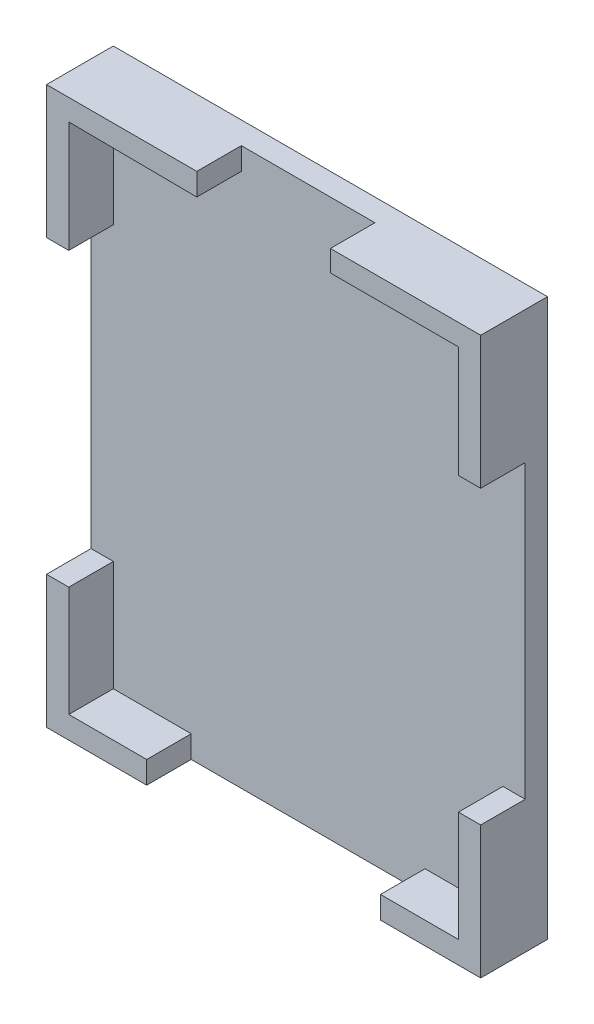
ISO-10303-21;
HEADER;
FILE_DESCRIPTION(('STEP AP214'),'2;1');
FILE_NAME('part.step','',(''),(''),'','','');
FILE_SCHEMA(('AUTOMOTIVE_DESIGN { 1 0 10303 214 1 1 1 1 }'));
ENDSEC;
DATA;
#1=APPLICATION_CONTEXT('core data for automotive mechanical design processes');
#2=APPLICATION_PROTOCOL_DEFINITION('international standard','automotive_design',2000,#1);
#3=PRODUCT_CONTEXT('',#1,'mechanical');
#4=PRODUCT('Part','Part','',(#3));
#5=PRODUCT_RELATED_PRODUCT_CATEGORY('part','',(#4));
#6=PRODUCT_DEFINITION_FORMATION('','',#4);
#7=PRODUCT_DEFINITION_CONTEXT('part definition',#1,'design');
#8=PRODUCT_DEFINITION('design','',#6,#7);
#9=PRODUCT_DEFINITION_SHAPE('','',#8);
#10=(LENGTH_UNIT() NAMED_UNIT(*) SI_UNIT(.MILLI.,.METRE.));
#11=(NAMED_UNIT(*) PLANE_ANGLE_UNIT() SI_UNIT($,.RADIAN.));
#12=(NAMED_UNIT(*) SI_UNIT($,.STERADIAN.) SOLID_ANGLE_UNIT());
#13=UNCERTAINTY_MEASURE_WITH_UNIT(LENGTH_MEASURE(1.E-05),#10,'distance_accuracy_value','');
#14=(GEOMETRIC_REPRESENTATION_CONTEXT(3) GLOBAL_UNCERTAINTY_ASSIGNED_CONTEXT((#13)) GLOBAL_UNIT_ASSIGNED_CONTEXT((#10,
#11,#12)) REPRESENTATION_CONTEXT('',''));
#15=CARTESIAN_POINT('',(0.,0.,0.));
#16=DIRECTION('',(0.,0.,1.));
#17=DIRECTION('',(1.,0.,0.));
#18=AXIS2_PLACEMENT_3D('',#15,#16,#17);
#19=CARTESIAN_POINT('',(0.,0.,2.));
#20=DIRECTION('',(0.,0.,1.));
#21=DIRECTION('',(1.,0.,0.));
#22=AXIS2_PLACEMENT_3D('',#19,#20,#21);
#23=PLANE('',#22);
#24=DIRECTION('',(-1.,0.,0.));
#25=VECTOR('',#24,1.);
#26=CARTESIAN_POINT('',(0.,2.,2.));
#27=LINE('',#26,#25);
#28=CARTESIAN_POINT('',(9.,2.,2.));
#29=VERTEX_POINT('',#28);
#30=CARTESIAN_POINT('',(2.,2.,2.));
#31=VERTEX_POINT('',#30);
#32=EDGE_CURVE('E54',#29,#31,#27,.T.);
#33=ORIENTED_EDGE('',*,*,#32,.F.);
#34=DIRECTION('',(0.,-1.,0.));
#35=VECTOR('',#34,1.);
#36=CARTESIAN_POINT('',(9.,0.,2.));
#37=LINE('',#36,#35);
#38=CARTESIAN_POINT('',(9.,0.,2.));
#39=VERTEX_POINT('',#38);
#40=EDGE_CURVE('E245',#29,#39,#37,.T.);
#41=ORIENTED_EDGE('',*,*,#40,.T.);
#42=DIRECTION('',(1.,0.,0.));
#43=VECTOR('',#42,1.);
#44=CARTESIAN_POINT('',(0.,0.,2.));
#45=LINE('',#44,#43);
#46=CARTESIAN_POINT('',(30.,0.,2.));
#47=VERTEX_POINT('',#46);
#48=EDGE_CURVE('E375',#39,#47,#45,.T.);
#49=ORIENTED_EDGE('',*,*,#48,.T.);
#50=DIRECTION('',(0.,-1.,0.));
#51=VECTOR('',#50,1.);
#52=CARTESIAN_POINT('',(30.,0.,2.));
#53=LINE('',#52,#51);
#54=CARTESIAN_POINT('',(30.,2.,2.));
#55=VERTEX_POINT('',#54);
#56=EDGE_CURVE('E284',#55,#47,#53,.T.);
#57=ORIENTED_EDGE('',*,*,#56,.F.);
#58=DIRECTION('',(1.,0.,0.));
#59=VECTOR('',#58,1.);
#60=CARTESIAN_POINT('',(0.,2.,2.));
#61=LINE('',#60,#59);
#62=CARTESIAN_POINT('',(37.,2.,2.));
#63=VERTEX_POINT('',#62);
#64=EDGE_CURVE('E275',#55,#63,#61,.T.);
#65=ORIENTED_EDGE('',*,*,#64,.T.);
#66=DIRECTION('',(0.,-1.,0.));
#67=VECTOR('',#66,1.);
#68=CARTESIAN_POINT('',(37.,0.,2.));
#69=LINE('',#68,#67);
#70=CARTESIAN_POINT('',(37.,11.9052817792916,2.));
#71=VERTEX_POINT('',#70);
#72=EDGE_CURVE('E278',#71,#63,#69,.T.);
#73=ORIENTED_EDGE('',*,*,#72,.F.);
#74=DIRECTION('',(1.,0.,0.));
#75=VECTOR('',#74,1.);
#76=CARTESIAN_POINT('',(0.,11.9052817792916,2.));
#77=LINE('',#76,#75);
#78=CARTESIAN_POINT('',(39.,11.9052817792916,2.));
#79=VERTEX_POINT('',#78);
#80=EDGE_CURVE('E281',#71,#79,#77,.T.);
#81=ORIENTED_EDGE('',*,*,#80,.T.);
#82=DIRECTION('',(0.,1.,0.));
#83=VECTOR('',#82,1.);
#84=CARTESIAN_POINT('',(39.,0.,2.));
#85=LINE('',#84,#83);
#86=CARTESIAN_POINT('',(39.,38.0947182207085,2.));
#87=VERTEX_POINT('',#86);
#88=EDGE_CURVE('E378',#79,#87,#85,.T.);
#89=ORIENTED_EDGE('',*,*,#88,.T.);
#90=DIRECTION('',(1.,0.,0.));
#91=VECTOR('',#90,1.);
#92=CARTESIAN_POINT('',(0.,38.0947182207085,2.));
#93=LINE('',#92,#91);
#94=CARTESIAN_POINT('',(37.,38.0947182207085,2.));
#95=VERTEX_POINT('',#94);
#96=EDGE_CURVE('E319',#95,#87,#93,.T.);
#97=ORIENTED_EDGE('',*,*,#96,.F.);
#98=DIRECTION('',(0.,1.,0.));
#99=VECTOR('',#98,1.);
#100=CARTESIAN_POINT('',(37.,0.,2.));
#101=LINE('',#100,#99);
#102=CARTESIAN_POINT('',(37.,48.0947182207085,2.));
#103=VERTEX_POINT('',#102);
#104=EDGE_CURVE('E322',#95,#103,#101,.T.);
#105=ORIENTED_EDGE('',*,*,#104,.T.);
#106=DIRECTION('',(1.,0.,0.));
#107=VECTOR('',#106,1.);
#108=CARTESIAN_POINT('',(0.,48.0947182207085,2.));
#109=LINE('',#108,#107);
#110=CARTESIAN_POINT('',(25.5,48.0947182207085,2.));
#111=VERTEX_POINT('',#110);
#112=EDGE_CURVE('E324',#111,#103,#109,.T.);
#113=ORIENTED_EDGE('',*,*,#112,.F.);
#114=DIRECTION('',(0.,-1.,0.));
#115=VECTOR('',#114,1.);
#116=CARTESIAN_POINT('',(25.5,0.,2.));
#117=LINE('',#116,#115);
#118=CARTESIAN_POINT('',(25.5,50.,2.));
#119=VERTEX_POINT('',#118);
#120=EDGE_CURVE('E327',#119,#111,#117,.T.);
#121=ORIENTED_EDGE('',*,*,#120,.F.);
#122=DIRECTION('',(1.,0.,0.));
#123=VECTOR('',#122,1.);
#124=CARTESIAN_POINT('',(0.,50.,2.));
#125=LINE('',#124,#123);
#126=CARTESIAN_POINT('',(13.5,50.,2.));
#127=VERTEX_POINT('',#126);
#128=EDGE_CURVE('E380',#127,#119,#125,.T.);
#129=ORIENTED_EDGE('',*,*,#128,.F.);
#130=DIRECTION('',(0.,1.,0.));
#131=VECTOR('',#130,1.);
#132=CARTESIAN_POINT('',(13.5,0.,2.));
#133=LINE('',#132,#131);
#134=CARTESIAN_POINT('',(13.5,48.,2.));
#135=VERTEX_POINT('',#134);
#136=EDGE_CURVE('E365',#135,#127,#133,.T.);
#137=ORIENTED_EDGE('',*,*,#136,.F.);
#138=DIRECTION('',(-0.999966082854809,0.00823608766407027,0.));
#139=VECTOR('',#138,1.);
#140=CARTESIAN_POINT('',(0.396234546725618,48.1079274215926,2.));
#141=LINE('',#140,#139);
#142=CARTESIAN_POINT('',(2.00000000000001,48.0947182207085,2.));
#143=VERTEX_POINT('',#142);
#144=EDGE_CURVE('E368',#135,#143,#141,.T.);
#145=ORIENTED_EDGE('',*,*,#144,.T.);
#146=DIRECTION('',(0.,1.,0.));
#147=VECTOR('',#146,1.);
#148=CARTESIAN_POINT('',(2.00000000000001,0.,2.));
#149=LINE('',#148,#147);
#150=CARTESIAN_POINT('',(2.00000000000001,38.0947182207085,2.));
#151=VERTEX_POINT('',#150);
#152=EDGE_CURVE('E370',#151,#143,#149,.T.);
#153=ORIENTED_EDGE('',*,*,#152,.F.);
#154=DIRECTION('',(1.,0.,0.));
#155=VECTOR('',#154,1.);
#156=CARTESIAN_POINT('',(0.,38.0947182207085,2.));
#157=LINE('',#156,#155);
#158=CARTESIAN_POINT('',(0.,38.0947182207085,2.));
#159=VERTEX_POINT('',#158);
#160=EDGE_CURVE('E362',#159,#151,#157,.T.);
#161=ORIENTED_EDGE('',*,*,#160,.F.);
#162=DIRECTION('',(0.,1.,0.));
#163=VECTOR('',#162,1.);
#164=CARTESIAN_POINT('',(0.,0.,2.));
#165=LINE('',#164,#163);
#166=CARTESIAN_POINT('',(0.,11.9052817792916,2.));
#167=VERTEX_POINT('',#166);
#168=EDGE_CURVE('E373',#167,#159,#165,.T.);
#169=ORIENTED_EDGE('',*,*,#168,.F.);
#170=DIRECTION('',(-1.,0.,0.));
#171=VECTOR('',#170,1.);
#172=CARTESIAN_POINT('',(0.,11.9052817792916,2.));
#173=LINE('',#172,#171);
#174=CARTESIAN_POINT('',(2.,11.9052817792916,2.));
#175=VERTEX_POINT('',#174);
#176=EDGE_CURVE('E240',#175,#167,#173,.T.);
#177=ORIENTED_EDGE('',*,*,#176,.F.);
#178=DIRECTION('',(0.,-1.,0.));
#179=VECTOR('',#178,1.);
#180=CARTESIAN_POINT('',(2.,0.,2.));
#181=LINE('',#180,#179);
#182=EDGE_CURVE('E59',#175,#31,#181,.T.);
#183=ORIENTED_EDGE('',*,*,#182,.T.);
#184=EDGE_LOOP('',(#33,#41,#49,#57,#65,#73,#81,#89,#97,#105,#113,#121,#129,#137,#145,#153,#161,
#169,#177,#183));
#185=FACE_BOUND('',#184,.T.);
#186=ADVANCED_FACE('F39',(#185),#23,.T.);
#187=CARTESIAN_POINT('',(0.,0.,2.));
#188=DIRECTION('',(-1.,0.,0.));
#189=DIRECTION('',(0.,-1.,0.));
#190=AXIS2_PLACEMENT_3D('',#187,#188,#189);
#191=PLANE('',#190);
#192=DIRECTION('',(0.,0.,-1.));
#193=VECTOR('',#192,1.);
#194=CARTESIAN_POINT('',(0.,50.,2.));
#195=LINE('',#194,#193);
#196=CARTESIAN_POINT('',(0.,50.,6.));
#197=VERTEX_POINT('',#196);
#198=CARTESIAN_POINT('',(0.,50.,0.));
#199=VERTEX_POINT('',#198);
#200=EDGE_CURVE('E383',#197,#199,#195,.T.);
#201=ORIENTED_EDGE('',*,*,#200,.T.);
#202=DIRECTION('',(0.,1.,0.));
#203=VECTOR('',#202,1.);
#204=CARTESIAN_POINT('',(0.,0.,0.));
#205=LINE('',#204,#203);
#206=CARTESIAN_POINT('',(0.,0.,0.));
#207=VERTEX_POINT('',#206);
#208=EDGE_CURVE('E203',#207,#199,#205,.T.);
#209=ORIENTED_EDGE('',*,*,#208,.F.);
#210=DIRECTION('',(0.,0.,-1.));
#211=VECTOR('',#210,1.);
#212=CARTESIAN_POINT('',(0.,0.,2.));
#213=LINE('',#212,#211);
#214=CARTESIAN_POINT('',(0.,0.,6.));
#215=VERTEX_POINT('',#214);
#216=EDGE_CURVE('E11',#215,#207,#213,.T.);
#217=ORIENTED_EDGE('',*,*,#216,.F.);
#218=DIRECTION('',(0.,1.,0.));
#219=VECTOR('',#218,1.);
#220=CARTESIAN_POINT('',(0.,0.,6.));
#221=LINE('',#220,#219);
#222=CARTESIAN_POINT('',(0.,11.9052817792916,6.));
#223=VERTEX_POINT('',#222);
#224=EDGE_CURVE('E201',#215,#223,#221,.T.);
#225=ORIENTED_EDGE('',*,*,#224,.T.);
#226=DIRECTION('',(0.,0.,-1.));
#227=VECTOR('',#226,1.);
#228=CARTESIAN_POINT('',(0.,11.9052817792916,6.));
#229=LINE('',#228,#227);
#230=EDGE_CURVE('E228',#223,#167,#229,.T.);
#231=ORIENTED_EDGE('',*,*,#230,.T.);
#232=ORIENTED_EDGE('',*,*,#168,.T.);
#233=DIRECTION('',(0.,0.,-1.));
#234=VECTOR('',#233,1.);
#235=CARTESIAN_POINT('',(0.,38.0947182207085,6.));
#236=LINE('',#235,#234);
#237=CARTESIAN_POINT('',(0.,38.0947182207085,6.));
#238=VERTEX_POINT('',#237);
#239=EDGE_CURVE('E350',#238,#159,#236,.T.);
#240=ORIENTED_EDGE('',*,*,#239,.F.);
#241=DIRECTION('',(0.,1.,0.));
#242=VECTOR('',#241,1.);
#243=CARTESIAN_POINT('',(0.,0.,6.));
#244=LINE('',#243,#242);
#245=EDGE_CURVE('E341',#238,#197,#244,.T.);
#246=ORIENTED_EDGE('',*,*,#245,.T.);
#247=EDGE_LOOP('',(#201,#209,#217,#225,#231,#232,#240,#246));
#248=FACE_BOUND('',#247,.T.);
#249=ADVANCED_FACE('F41',(#248),#191,.T.);
#250=CARTESIAN_POINT('',(0.,0.,2.));
#251=DIRECTION('',(0.,1.,0.));
#252=DIRECTION('',(0.,0.,1.));
#253=AXIS2_PLACEMENT_3D('',#250,#251,#252);
#254=PLANE('',#253);
#255=DIRECTION('',(1.,0.,0.));
#256=VECTOR('',#255,1.);
#257=CARTESIAN_POINT('',(0.,0.,0.));
#258=LINE('',#257,#256);
#259=CARTESIAN_POINT('',(39.,0.,0.));
#260=VERTEX_POINT('',#259);
#261=EDGE_CURVE('E385',#207,#260,#258,.T.);
#262=ORIENTED_EDGE('',*,*,#261,.T.);
#263=DIRECTION('',(0.,0.,-1.));
#264=VECTOR('',#263,1.);
#265=CARTESIAN_POINT('',(39.,0.,2.));
#266=LINE('',#265,#264);
#267=CARTESIAN_POINT('',(39.,0.,6.));
#268=VERTEX_POINT('',#267);
#269=EDGE_CURVE('E47',#268,#260,#266,.T.);
#270=ORIENTED_EDGE('',*,*,#269,.F.);
#271=DIRECTION('',(-1.,0.,0.));
#272=VECTOR('',#271,1.);
#273=CARTESIAN_POINT('',(0.,0.,6.));
#274=LINE('',#273,#272);
#275=CARTESIAN_POINT('',(30.,0.,6.));
#276=VERTEX_POINT('',#275);
#277=EDGE_CURVE('E250',#268,#276,#274,.T.);
#278=ORIENTED_EDGE('',*,*,#277,.T.);
#279=DIRECTION('',(0.,0.,-1.));
#280=VECTOR('',#279,1.);
#281=CARTESIAN_POINT('',(30.,0.,6.));
#282=LINE('',#281,#280);
#283=EDGE_CURVE('E272',#276,#47,#282,.T.);
#284=ORIENTED_EDGE('',*,*,#283,.T.);
#285=ORIENTED_EDGE('',*,*,#48,.F.);
#286=DIRECTION('',(0.,0.,-1.));
#287=VECTOR('',#286,1.);
#288=CARTESIAN_POINT('',(9.,0.,6.));
#289=LINE('',#288,#287);
#290=CARTESIAN_POINT('',(9.,0.,6.));
#291=VERTEX_POINT('',#290);
#292=EDGE_CURVE('E211',#291,#39,#289,.T.);
#293=ORIENTED_EDGE('',*,*,#292,.F.);
#294=DIRECTION('',(1.,0.,0.));
#295=VECTOR('',#294,1.);
#296=CARTESIAN_POINT('',(0.,0.,6.));
#297=LINE('',#296,#295);
#298=EDGE_CURVE('E207',#215,#291,#297,.T.);
#299=ORIENTED_EDGE('',*,*,#298,.F.);
#300=ORIENTED_EDGE('',*,*,#216,.T.);
#301=EDGE_LOOP('',(#262,#270,#278,#284,#285,#293,#299,#300));
#302=FACE_BOUND('',#301,.T.);
#303=ADVANCED_FACE('F208',(#302),#254,.F.);
#304=CARTESIAN_POINT('',(39.,0.,2.));
#305=DIRECTION('',(-1.,0.,0.));
#306=DIRECTION('',(0.,-1.,0.));
#307=AXIS2_PLACEMENT_3D('',#304,#305,#306);
#308=PLANE('',#307);
#309=DIRECTION('',(0.,1.,0.));
#310=VECTOR('',#309,1.);
#311=CARTESIAN_POINT('',(39.,0.,0.));
#312=LINE('',#311,#310);
#313=CARTESIAN_POINT('',(39.,50.,0.));
#314=VERTEX_POINT('',#313);
#315=EDGE_CURVE('E387',#260,#314,#312,.T.);
#316=ORIENTED_EDGE('',*,*,#315,.T.);
#317=DIRECTION('',(0.,0.,-1.));
#318=VECTOR('',#317,1.);
#319=CARTESIAN_POINT('',(39.,50.,2.));
#320=LINE('',#319,#318);
#321=CARTESIAN_POINT('',(39.,50.,6.));
#322=VERTEX_POINT('',#321);
#323=EDGE_CURVE('E392',#322,#314,#320,.T.);
#324=ORIENTED_EDGE('',*,*,#323,.F.);
#325=DIRECTION('',(0.,-1.,0.));
#326=VECTOR('',#325,1.);
#327=CARTESIAN_POINT('',(39.,0.,6.));
#328=LINE('',#327,#326);
#329=CARTESIAN_POINT('',(39.,38.0947182207085,6.));
#330=VERTEX_POINT('',#329);
#331=EDGE_CURVE('E301',#322,#330,#328,.T.);
#332=ORIENTED_EDGE('',*,*,#331,.T.);
#333=DIRECTION('',(0.,0.,-1.));
#334=VECTOR('',#333,1.);
#335=CARTESIAN_POINT('',(39.,38.0947182207085,6.));
#336=LINE('',#335,#334);
#337=EDGE_CURVE('E304',#330,#87,#336,.T.);
#338=ORIENTED_EDGE('',*,*,#337,.T.);
#339=ORIENTED_EDGE('',*,*,#88,.F.);
#340=DIRECTION('',(0.,0.,-1.));
#341=VECTOR('',#340,1.);
#342=CARTESIAN_POINT('',(39.,11.9052817792916,6.));
#343=LINE('',#342,#341);
#344=CARTESIAN_POINT('',(39.,11.9052817792916,6.));
#345=VERTEX_POINT('',#344);
#346=EDGE_CURVE('E270',#345,#79,#343,.T.);
#347=ORIENTED_EDGE('',*,*,#346,.F.);
#348=DIRECTION('',(0.,1.,0.));
#349=VECTOR('',#348,1.);
#350=CARTESIAN_POINT('',(39.,0.,6.));
#351=LINE('',#350,#349);
#352=EDGE_CURVE('E253',#268,#345,#351,.T.);
#353=ORIENTED_EDGE('',*,*,#352,.F.);
#354=ORIENTED_EDGE('',*,*,#269,.T.);
#355=EDGE_LOOP('',(#316,#324,#332,#338,#339,#347,#353,#354));
#356=FACE_BOUND('',#355,.T.);
#357=ADVANCED_FACE('F398',(#356),#308,.F.);
#358=CARTESIAN_POINT('',(0.,50.,2.));
#359=DIRECTION('',(0.,1.,0.));
#360=DIRECTION('',(0.,0.,1.));
#361=AXIS2_PLACEMENT_3D('',#358,#359,#360);
#362=PLANE('',#361);
#363=ORIENTED_EDGE('',*,*,#128,.T.);
#364=DIRECTION('',(0.,0.,-1.));
#365=VECTOR('',#364,1.);
#366=CARTESIAN_POINT('',(25.5,50.,6.));
#367=LINE('',#366,#365);
#368=CARTESIAN_POINT('',(25.5,50.,6.));
#369=VERTEX_POINT('',#368);
#370=EDGE_CURVE('E316',#369,#119,#367,.T.);
#371=ORIENTED_EDGE('',*,*,#370,.F.);
#372=DIRECTION('',(1.,0.,0.));
#373=VECTOR('',#372,1.);
#374=CARTESIAN_POINT('',(0.,50.,6.));
#375=LINE('',#374,#373);
#376=EDGE_CURVE('E287',#369,#322,#375,.T.);
#377=ORIENTED_EDGE('',*,*,#376,.T.);
#378=ORIENTED_EDGE('',*,*,#323,.T.);
#379=DIRECTION('',(1.,0.,0.));
#380=VECTOR('',#379,1.);
#381=CARTESIAN_POINT('',(0.,50.,0.));
#382=LINE('',#381,#380);
#383=EDGE_CURVE('E376',#199,#314,#382,.T.);
#384=ORIENTED_EDGE('',*,*,#383,.F.);
#385=ORIENTED_EDGE('',*,*,#200,.F.);
#386=DIRECTION('',(1.,0.,0.));
#387=VECTOR('',#386,1.);
#388=CARTESIAN_POINT('',(0.,50.,6.));
#389=LINE('',#388,#387);
#390=CARTESIAN_POINT('',(13.5,50.,6.));
#391=VERTEX_POINT('',#390);
#392=EDGE_CURVE('E338',#197,#391,#389,.T.);
#393=ORIENTED_EDGE('',*,*,#392,.T.);
#394=DIRECTION('',(0.,0.,-1.));
#395=VECTOR('',#394,1.);
#396=CARTESIAN_POINT('',(13.5,50.,6.));
#397=LINE('',#396,#395);
#398=EDGE_CURVE('E353',#391,#127,#397,.T.);
#399=ORIENTED_EDGE('',*,*,#398,.T.);
#400=EDGE_LOOP('',(#363,#371,#377,#378,#384,#385,#393,#399));
#401=FACE_BOUND('',#400,.T.);
#402=ADVANCED_FACE('F405',(#401),#362,.T.);
#403=CARTESIAN_POINT('',(0.,0.,0.));
#404=DIRECTION('',(0.,0.,1.));
#405=DIRECTION('',(1.,0.,0.));
#406=AXIS2_PLACEMENT_3D('',#403,#404,#405);
#407=PLANE('',#406);
#408=ORIENTED_EDGE('',*,*,#315,.F.);
#409=ORIENTED_EDGE('',*,*,#261,.F.);
#410=ORIENTED_EDGE('',*,*,#208,.T.);
#411=ORIENTED_EDGE('',*,*,#383,.T.);
#412=EDGE_LOOP('',(#408,#409,#410,#411));
#413=FACE_BOUND('',#412,.T.);
#414=ADVANCED_FACE('F402',(#413),#407,.F.);
#415=CARTESIAN_POINT('',(2.00000000000001,0.,6.));
#416=DIRECTION('',(1.,0.,0.));
#417=DIRECTION('',(0.,0.,-1.));
#418=AXIS2_PLACEMENT_3D('',#415,#416,#417);
#419=PLANE('',#418);
#420=DIRECTION('',(0.,0.,-1.));
#421=VECTOR('',#420,1.);
#422=CARTESIAN_POINT('',(2.00000000000001,38.0947182207085,6.));
#423=LINE('',#422,#421);
#424=CARTESIAN_POINT('',(2.00000000000001,38.0947182207085,6.));
#425=VERTEX_POINT('',#424);
#426=EDGE_CURVE('E347',#425,#151,#423,.T.);
#427=ORIENTED_EDGE('',*,*,#426,.T.);
#428=ORIENTED_EDGE('',*,*,#152,.T.);
#429=DIRECTION('',(0.,0.,-1.));
#430=VECTOR('',#429,1.);
#431=CARTESIAN_POINT('',(2.,48.0947182207085,6.));
#432=LINE('',#431,#430);
#433=CARTESIAN_POINT('',(2.,48.0947182207085,6.));
#434=VERTEX_POINT('',#433);
#435=EDGE_CURVE('E359',#434,#143,#432,.T.);
#436=ORIENTED_EDGE('',*,*,#435,.F.);
#437=DIRECTION('',(0.,-1.,0.));
#438=VECTOR('',#437,1.);
#439=CARTESIAN_POINT('',(2.00000000000001,0.,6.));
#440=LINE('',#439,#438);
#441=EDGE_CURVE('E330',#434,#425,#440,.T.);
#442=ORIENTED_EDGE('',*,*,#441,.T.);
#443=EDGE_LOOP('',(#427,#428,#436,#442));
#444=FACE_BOUND('',#443,.T.);
#445=ADVANCED_FACE('F436',(#444),#419,.T.);
#446=CARTESIAN_POINT('',(0.396234546725618,48.1079274215926,6.));
#447=DIRECTION('',(0.00823608766407027,0.999966082854808,0.));
#448=DIRECTION('',(-0.999966082854809,0.00823608766407027,0.));
#449=AXIS2_PLACEMENT_3D('',#446,#447,#448);
#450=PLANE('',#449);
#451=ORIENTED_EDGE('',*,*,#144,.F.);
#452=DIRECTION('',(0.,0.,-1.));
#453=VECTOR('',#452,1.);
#454=CARTESIAN_POINT('',(13.5,48.,6.));
#455=LINE('',#454,#453);
#456=CARTESIAN_POINT('',(13.5,48.,6.));
#457=VERTEX_POINT('',#456);
#458=EDGE_CURVE('E356',#457,#135,#455,.T.);
#459=ORIENTED_EDGE('',*,*,#458,.F.);
#460=DIRECTION('',(0.999966082854809,-0.00823608766407027,0.));
#461=VECTOR('',#460,1.);
#462=CARTESIAN_POINT('',(0.396234546725618,48.1079274215926,6.));
#463=LINE('',#462,#461);
#464=EDGE_CURVE('E333',#434,#457,#463,.T.);
#465=ORIENTED_EDGE('',*,*,#464,.F.);
#466=ORIENTED_EDGE('',*,*,#435,.T.);
#467=EDGE_LOOP('',(#451,#459,#465,#466));
#468=FACE_BOUND('',#467,.T.);
#469=ADVANCED_FACE('F432',(#468),#450,.F.);
#470=CARTESIAN_POINT('',(13.5,0.,6.));
#471=DIRECTION('',(1.,0.,0.));
#472=DIRECTION('',(0.,1.,0.));
#473=AXIS2_PLACEMENT_3D('',#470,#471,#472);
#474=PLANE('',#473);
#475=ORIENTED_EDGE('',*,*,#458,.T.);
#476=ORIENTED_EDGE('',*,*,#136,.T.);
#477=ORIENTED_EDGE('',*,*,#398,.F.);
#478=DIRECTION('',(0.,-1.,0.));
#479=VECTOR('',#478,1.);
#480=CARTESIAN_POINT('',(13.5,0.,6.));
#481=LINE('',#480,#479);
#482=EDGE_CURVE('E335',#391,#457,#481,.T.);
#483=ORIENTED_EDGE('',*,*,#482,.T.);
#484=EDGE_LOOP('',(#475,#476,#477,#483));
#485=FACE_BOUND('',#484,.T.);
#486=ADVANCED_FACE('F427',(#485),#474,.T.);
#487=CARTESIAN_POINT('',(0.,38.0947182207085,6.));
#488=DIRECTION('',(0.,-1.,0.));
#489=DIRECTION('',(0.,0.,-1.));
#490=AXIS2_PLACEMENT_3D('',#487,#488,#489);
#491=PLANE('',#490);
#492=ORIENTED_EDGE('',*,*,#239,.T.);
#493=ORIENTED_EDGE('',*,*,#160,.T.);
#494=ORIENTED_EDGE('',*,*,#426,.F.);
#495=DIRECTION('',(-1.,0.,0.));
#496=VECTOR('',#495,1.);
#497=CARTESIAN_POINT('',(0.,38.0947182207085,6.));
#498=LINE('',#497,#496);
#499=EDGE_CURVE('E344',#425,#238,#498,.T.);
#500=ORIENTED_EDGE('',*,*,#499,.T.);
#501=EDGE_LOOP('',(#492,#493,#494,#500));
#502=FACE_BOUND('',#501,.T.);
#503=ADVANCED_FACE('F439',(#502),#491,.T.);
#504=CARTESIAN_POINT('',(0.,0.,6.));
#505=DIRECTION('',(0.,0.,1.));
#506=DIRECTION('',(1.,0.,0.));
#507=AXIS2_PLACEMENT_3D('',#504,#505,#506);
#508=PLANE('',#507);
#509=ORIENTED_EDGE('',*,*,#441,.F.);
#510=ORIENTED_EDGE('',*,*,#464,.T.);
#511=ORIENTED_EDGE('',*,*,#482,.F.);
#512=ORIENTED_EDGE('',*,*,#392,.F.);
#513=ORIENTED_EDGE('',*,*,#245,.F.);
#514=ORIENTED_EDGE('',*,*,#499,.F.);
#515=EDGE_LOOP('',(#509,#510,#511,#512,#513,#514));
#516=FACE_BOUND('',#515,.T.);
#517=ADVANCED_FACE('F530',(#516),#508,.T.);
#518=CARTESIAN_POINT('',(25.5,0.,6.));
#519=DIRECTION('',(-1.,0.,0.));
#520=DIRECTION('',(0.,0.,1.));
#521=AXIS2_PLACEMENT_3D('',#518,#519,#520);
#522=PLANE('',#521);
#523=ORIENTED_EDGE('',*,*,#370,.T.);
#524=ORIENTED_EDGE('',*,*,#120,.T.);
#525=DIRECTION('',(0.,0.,-1.));
#526=VECTOR('',#525,1.);
#527=CARTESIAN_POINT('',(25.5,48.0947182207085,6.));
#528=LINE('',#527,#526);
#529=CARTESIAN_POINT('',(25.5,48.0947182207085,6.));
#530=VERTEX_POINT('',#529);
#531=EDGE_CURVE('E313',#530,#111,#528,.T.);
#532=ORIENTED_EDGE('',*,*,#531,.F.);
#533=DIRECTION('',(0.,1.,0.));
#534=VECTOR('',#533,1.);
#535=CARTESIAN_POINT('',(25.5,0.,6.));
#536=LINE('',#535,#534);
#537=EDGE_CURVE('E290',#530,#369,#536,.T.);
#538=ORIENTED_EDGE('',*,*,#537,.T.);
#539=EDGE_LOOP('',(#523,#524,#532,#538));
#540=FACE_BOUND('',#539,.T.);
#541=ADVANCED_FACE('F424',(#540),#522,.T.);
#542=CARTESIAN_POINT('',(0.,48.0947182207085,6.));
#543=DIRECTION('',(0.,-1.,0.));
#544=DIRECTION('',(1.,0.,0.));
#545=AXIS2_PLACEMENT_3D('',#542,#543,#544);
#546=PLANE('',#545);
#547=ORIENTED_EDGE('',*,*,#531,.T.);
#548=ORIENTED_EDGE('',*,*,#112,.T.);
#549=DIRECTION('',(0.,0.,-1.));
#550=VECTOR('',#549,1.);
#551=CARTESIAN_POINT('',(37.,48.0947182207085,6.));
#552=LINE('',#551,#550);
#553=CARTESIAN_POINT('',(37.,48.0947182207085,6.));
#554=VERTEX_POINT('',#553);
#555=EDGE_CURVE('E310',#554,#103,#552,.T.);
#556=ORIENTED_EDGE('',*,*,#555,.F.);
#557=DIRECTION('',(-1.,0.,0.));
#558=VECTOR('',#557,1.);
#559=CARTESIAN_POINT('',(0.,48.0947182207085,6.));
#560=LINE('',#559,#558);
#561=EDGE_CURVE('E293',#554,#530,#560,.T.);
#562=ORIENTED_EDGE('',*,*,#561,.T.);
#563=EDGE_LOOP('',(#547,#548,#556,#562));
#564=FACE_BOUND('',#563,.T.);
#565=ADVANCED_FACE('F422',(#564),#546,.T.);
#566=CARTESIAN_POINT('',(37.,0.,6.));
#567=DIRECTION('',(1.,0.,0.));
#568=DIRECTION('',(0.,0.,-1.));
#569=AXIS2_PLACEMENT_3D('',#566,#567,#568);
#570=PLANE('',#569);
#571=ORIENTED_EDGE('',*,*,#104,.F.);
#572=DIRECTION('',(0.,0.,-1.));
#573=VECTOR('',#572,1.);
#574=CARTESIAN_POINT('',(37.,38.0947182207085,6.));
#575=LINE('',#574,#573);
#576=CARTESIAN_POINT('',(37.,38.0947182207085,6.));
#577=VERTEX_POINT('',#576);
#578=EDGE_CURVE('E307',#577,#95,#575,.T.);
#579=ORIENTED_EDGE('',*,*,#578,.F.);
#580=DIRECTION('',(0.,-1.,0.));
#581=VECTOR('',#580,1.);
#582=CARTESIAN_POINT('',(37.,0.,6.));
#583=LINE('',#582,#581);
#584=EDGE_CURVE('E296',#554,#577,#583,.T.);
#585=ORIENTED_EDGE('',*,*,#584,.F.);
#586=ORIENTED_EDGE('',*,*,#555,.T.);
#587=EDGE_LOOP('',(#571,#579,#585,#586));
#588=FACE_BOUND('',#587,.T.);
#589=ADVANCED_FACE('F420',(#588),#570,.F.);
#590=CARTESIAN_POINT('',(0.,38.0947182207085,6.));
#591=DIRECTION('',(0.,-1.,0.));
#592=DIRECTION('',(0.,0.,-1.));
#593=AXIS2_PLACEMENT_3D('',#590,#591,#592);
#594=PLANE('',#593);
#595=ORIENTED_EDGE('',*,*,#578,.T.);
#596=ORIENTED_EDGE('',*,*,#96,.T.);
#597=ORIENTED_EDGE('',*,*,#337,.F.);
#598=DIRECTION('',(-1.,0.,0.));
#599=VECTOR('',#598,1.);
#600=CARTESIAN_POINT('',(0.,38.0947182207085,6.));
#601=LINE('',#600,#599);
#602=EDGE_CURVE('E298',#330,#577,#601,.T.);
#603=ORIENTED_EDGE('',*,*,#602,.T.);
#604=EDGE_LOOP('',(#595,#596,#597,#603));
#605=FACE_BOUND('',#604,.T.);
#606=ADVANCED_FACE('F417',(#605),#594,.T.);
#607=CARTESIAN_POINT('',(0.,0.,6.));
#608=DIRECTION('',(0.,0.,1.));
#609=DIRECTION('',(1.,0.,0.));
#610=AXIS2_PLACEMENT_3D('',#607,#608,#609);
#611=PLANE('',#610);
#612=ORIENTED_EDGE('',*,*,#376,.F.);
#613=ORIENTED_EDGE('',*,*,#537,.F.);
#614=ORIENTED_EDGE('',*,*,#561,.F.);
#615=ORIENTED_EDGE('',*,*,#584,.T.);
#616=ORIENTED_EDGE('',*,*,#602,.F.);
#617=ORIENTED_EDGE('',*,*,#331,.F.);
#618=EDGE_LOOP('',(#612,#613,#614,#615,#616,#617));
#619=FACE_BOUND('',#618,.T.);
#620=ADVANCED_FACE('F411',(#619),#611,.T.);
#621=CARTESIAN_POINT('',(30.,0.,6.));
#622=DIRECTION('',(-1.,0.,0.));
#623=DIRECTION('',(0.,0.,1.));
#624=AXIS2_PLACEMENT_3D('',#621,#622,#623);
#625=PLANE('',#624);
#626=DIRECTION('',(0.,0.,-1.));
#627=VECTOR('',#626,1.);
#628=CARTESIAN_POINT('',(30.,2.,6.));
#629=LINE('',#628,#627);
#630=CARTESIAN_POINT('',(30.,2.,6.));
#631=VERTEX_POINT('',#630);
#632=EDGE_CURVE('E262',#631,#55,#629,.T.);
#633=ORIENTED_EDGE('',*,*,#632,.T.);
#634=ORIENTED_EDGE('',*,*,#56,.T.);
#635=ORIENTED_EDGE('',*,*,#283,.F.);
#636=DIRECTION('',(0.,1.,0.));
#637=VECTOR('',#636,1.);
#638=CARTESIAN_POINT('',(30.,0.,6.));
#639=LINE('',#638,#637);
#640=EDGE_CURVE('E247',#276,#631,#639,.T.);
#641=ORIENTED_EDGE('',*,*,#640,.T.);
#642=EDGE_LOOP('',(#633,#634,#635,#641));
#643=FACE_BOUND('',#642,.T.);
#644=ADVANCED_FACE('F455',(#643),#625,.T.);
#645=CARTESIAN_POINT('',(0.,11.9052817792916,6.));
#646=DIRECTION('',(0.,-1.,0.));
#647=DIRECTION('',(1.,0.,0.));
#648=AXIS2_PLACEMENT_3D('',#645,#646,#647);
#649=PLANE('',#648);
#650=ORIENTED_EDGE('',*,*,#80,.F.);
#651=DIRECTION('',(0.,0.,-1.));
#652=VECTOR('',#651,1.);
#653=CARTESIAN_POINT('',(37.,11.9052817792916,6.));
#654=LINE('',#653,#652);
#655=CARTESIAN_POINT('',(37.,11.9052817792916,6.));
#656=VERTEX_POINT('',#655);
#657=EDGE_CURVE('E267',#656,#71,#654,.T.);
#658=ORIENTED_EDGE('',*,*,#657,.F.);
#659=DIRECTION('',(-1.,0.,0.));
#660=VECTOR('',#659,1.);
#661=CARTESIAN_POINT('',(0.,11.9052817792916,6.));
#662=LINE('',#661,#660);
#663=EDGE_CURVE('E255',#345,#656,#662,.T.);
#664=ORIENTED_EDGE('',*,*,#663,.F.);
#665=ORIENTED_EDGE('',*,*,#346,.T.);
#666=EDGE_LOOP('',(#650,#658,#664,#665));
#667=FACE_BOUND('',#666,.T.);
#668=ADVANCED_FACE('F469',(#667),#649,.F.);
#669=CARTESIAN_POINT('',(37.,0.,6.));
#670=DIRECTION('',(-1.,0.,0.));
#671=DIRECTION('',(0.,0.,1.));
#672=AXIS2_PLACEMENT_3D('',#669,#670,#671);
#673=PLANE('',#672);
#674=ORIENTED_EDGE('',*,*,#657,.T.);
#675=ORIENTED_EDGE('',*,*,#72,.T.);
#676=DIRECTION('',(0.,0.,-1.));
#677=VECTOR('',#676,1.);
#678=CARTESIAN_POINT('',(37.,2.,6.));
#679=LINE('',#678,#677);
#680=CARTESIAN_POINT('',(37.,2.,6.));
#681=VERTEX_POINT('',#680);
#682=EDGE_CURVE('E265',#681,#63,#679,.T.);
#683=ORIENTED_EDGE('',*,*,#682,.F.);
#684=DIRECTION('',(0.,1.,0.));
#685=VECTOR('',#684,1.);
#686=CARTESIAN_POINT('',(37.,0.,6.));
#687=LINE('',#686,#685);
#688=EDGE_CURVE('E257',#681,#656,#687,.T.);
#689=ORIENTED_EDGE('',*,*,#688,.T.);
#690=EDGE_LOOP('',(#674,#675,#683,#689));
#691=FACE_BOUND('',#690,.T.);
#692=ADVANCED_FACE('F465',(#691),#673,.T.);
#693=CARTESIAN_POINT('',(0.,2.,6.));
#694=DIRECTION('',(0.,-1.,0.));
#695=DIRECTION('',(1.,0.,0.));
#696=AXIS2_PLACEMENT_3D('',#693,#694,#695);
#697=PLANE('',#696);
#698=ORIENTED_EDGE('',*,*,#64,.F.);
#699=ORIENTED_EDGE('',*,*,#632,.F.);
#700=DIRECTION('',(-1.,0.,0.));
#701=VECTOR('',#700,1.);
#702=CARTESIAN_POINT('',(0.,2.,6.));
#703=LINE('',#702,#701);
#704=EDGE_CURVE('E260',#681,#631,#703,.T.);
#705=ORIENTED_EDGE('',*,*,#704,.F.);
#706=ORIENTED_EDGE('',*,*,#682,.T.);
#707=EDGE_LOOP('',(#698,#699,#705,#706));
#708=FACE_BOUND('',#707,.T.);
#709=ADVANCED_FACE('F462',(#708),#697,.F.);
#710=CARTESIAN_POINT('',(0.,0.,6.));
#711=DIRECTION('',(0.,0.,1.));
#712=DIRECTION('',(1.,0.,0.));
#713=AXIS2_PLACEMENT_3D('',#710,#711,#712);
#714=PLANE('',#713);
#715=ORIENTED_EDGE('',*,*,#640,.F.);
#716=ORIENTED_EDGE('',*,*,#277,.F.);
#717=ORIENTED_EDGE('',*,*,#352,.T.);
#718=ORIENTED_EDGE('',*,*,#663,.T.);
#719=ORIENTED_EDGE('',*,*,#688,.F.);
#720=ORIENTED_EDGE('',*,*,#704,.T.);
#721=EDGE_LOOP('',(#715,#716,#717,#718,#719,#720));
#722=FACE_BOUND('',#721,.T.);
#723=ADVANCED_FACE('F457',(#722),#714,.T.);
#724=CARTESIAN_POINT('',(9.,0.,6.));
#725=DIRECTION('',(-1.,0.,0.));
#726=DIRECTION('',(0.,0.,1.));
#727=AXIS2_PLACEMENT_3D('',#724,#725,#726);
#728=PLANE('',#727);
#729=ORIENTED_EDGE('',*,*,#40,.F.);
#730=DIRECTION('',(0.,0.,-1.));
#731=VECTOR('',#730,1.);
#732=CARTESIAN_POINT('',(9.,2.,6.));
#733=LINE('',#732,#731);
#734=CARTESIAN_POINT('',(9.,2.,6.));
#735=VERTEX_POINT('',#734);
#736=EDGE_CURVE('E236',#735,#29,#733,.T.);
#737=ORIENTED_EDGE('',*,*,#736,.F.);
#738=DIRECTION('',(0.,1.,0.));
#739=VECTOR('',#738,1.);
#740=CARTESIAN_POINT('',(9.,0.,6.));
#741=LINE('',#740,#739);
#742=EDGE_CURVE('E214',#291,#735,#741,.T.);
#743=ORIENTED_EDGE('',*,*,#742,.F.);
#744=ORIENTED_EDGE('',*,*,#292,.T.);
#745=EDGE_LOOP('',(#729,#737,#743,#744));
#746=FACE_BOUND('',#745,.T.);
#747=ADVANCED_FACE('F451',(#746),#728,.F.);
#748=CARTESIAN_POINT('',(0.,2.,6.));
#749=DIRECTION('',(0.,1.,0.));
#750=DIRECTION('',(-1.,0.,0.));
#751=AXIS2_PLACEMENT_3D('',#748,#749,#750);
#752=PLANE('',#751);
#753=ORIENTED_EDGE('',*,*,#736,.T.);
#754=ORIENTED_EDGE('',*,*,#32,.T.);
#755=DIRECTION('',(0.,0.,-1.));
#756=VECTOR('',#755,1.);
#757=CARTESIAN_POINT('',(2.,2.,6.));
#758=LINE('',#757,#756);
#759=CARTESIAN_POINT('',(2.,2.,6.));
#760=VERTEX_POINT('',#759);
#761=EDGE_CURVE('E233',#760,#31,#758,.T.);
#762=ORIENTED_EDGE('',*,*,#761,.F.);
#763=DIRECTION('',(1.,0.,0.));
#764=VECTOR('',#763,1.);
#765=CARTESIAN_POINT('',(0.,2.,6.));
#766=LINE('',#765,#764);
#767=EDGE_CURVE('E222',#760,#735,#766,.T.);
#768=ORIENTED_EDGE('',*,*,#767,.T.);
#769=EDGE_LOOP('',(#753,#754,#762,#768));
#770=FACE_BOUND('',#769,.T.);
#771=ADVANCED_FACE('F448',(#770),#752,.T.);
#772=CARTESIAN_POINT('',(2.,0.,6.));
#773=DIRECTION('',(-1.,0.,0.));
#774=DIRECTION('',(0.,-1.,0.));
#775=AXIS2_PLACEMENT_3D('',#772,#773,#774);
#776=PLANE('',#775);
#777=ORIENTED_EDGE('',*,*,#182,.F.);
#778=DIRECTION('',(0.,0.,-1.));
#779=VECTOR('',#778,1.);
#780=CARTESIAN_POINT('',(2.,11.9052817792916,6.));
#781=LINE('',#780,#779);
#782=CARTESIAN_POINT('',(2.,11.9052817792916,6.));
#783=VERTEX_POINT('',#782);
#784=EDGE_CURVE('E230',#783,#175,#781,.T.);
#785=ORIENTED_EDGE('',*,*,#784,.F.);
#786=DIRECTION('',(0.,1.,0.));
#787=VECTOR('',#786,1.);
#788=CARTESIAN_POINT('',(2.,0.,6.));
#789=LINE('',#788,#787);
#790=EDGE_CURVE('E225',#760,#783,#789,.T.);
#791=ORIENTED_EDGE('',*,*,#790,.F.);
#792=ORIENTED_EDGE('',*,*,#761,.T.);
#793=EDGE_LOOP('',(#777,#785,#791,#792));
#794=FACE_BOUND('',#793,.T.);
#795=ADVANCED_FACE('F445',(#794),#776,.F.);
#796=CARTESIAN_POINT('',(0.,11.9052817792916,6.));
#797=DIRECTION('',(0.,1.,0.));
#798=DIRECTION('',(-1.,0.,0.));
#799=AXIS2_PLACEMENT_3D('',#796,#797,#798);
#800=PLANE('',#799);
#801=ORIENTED_EDGE('',*,*,#784,.T.);
#802=ORIENTED_EDGE('',*,*,#176,.T.);
#803=ORIENTED_EDGE('',*,*,#230,.F.);
#804=DIRECTION('',(1.,0.,0.));
#805=VECTOR('',#804,1.);
#806=CARTESIAN_POINT('',(0.,11.9052817792916,6.));
#807=LINE('',#806,#805);
#808=EDGE_CURVE('E218',#223,#783,#807,.T.);
#809=ORIENTED_EDGE('',*,*,#808,.T.);
#810=EDGE_LOOP('',(#801,#802,#803,#809));
#811=FACE_BOUND('',#810,.T.);
#812=ADVANCED_FACE('F441',(#811),#800,.T.);
#813=CARTESIAN_POINT('',(0.,0.,6.));
#814=DIRECTION('',(0.,0.,1.));
#815=DIRECTION('',(1.,0.,0.));
#816=AXIS2_PLACEMENT_3D('',#813,#814,#815);
#817=PLANE('',#816);
#818=ORIENTED_EDGE('',*,*,#224,.F.);
#819=ORIENTED_EDGE('',*,*,#298,.T.);
#820=ORIENTED_EDGE('',*,*,#742,.T.);
#821=ORIENTED_EDGE('',*,*,#767,.F.);
#822=ORIENTED_EDGE('',*,*,#790,.T.);
#823=ORIENTED_EDGE('',*,*,#808,.F.);
#824=EDGE_LOOP('',(#818,#819,#820,#821,#822,#823));
#825=FACE_BOUND('',#824,.T.);
#826=ADVANCED_FACE('F216',(#825),#817,.T.);
#827=CLOSED_SHELL('',(#186,#249,#303,#357,#402,#414,#445,#469,#486,#503,#517,#541,#565,#589,
#606,#620,#644,#668,#692,#709,#723,#747,#771,#795,#812,#826));
#828=MANIFOLD_SOLID_BREP('B2',#827);
#829=ADVANCED_BREP_SHAPE_REPRESENTATION('',(#18,#828),#14);
#830=SHAPE_DEFINITION_REPRESENTATION(#9,#829);
ENDSEC;
END-ISO-10303-21;
